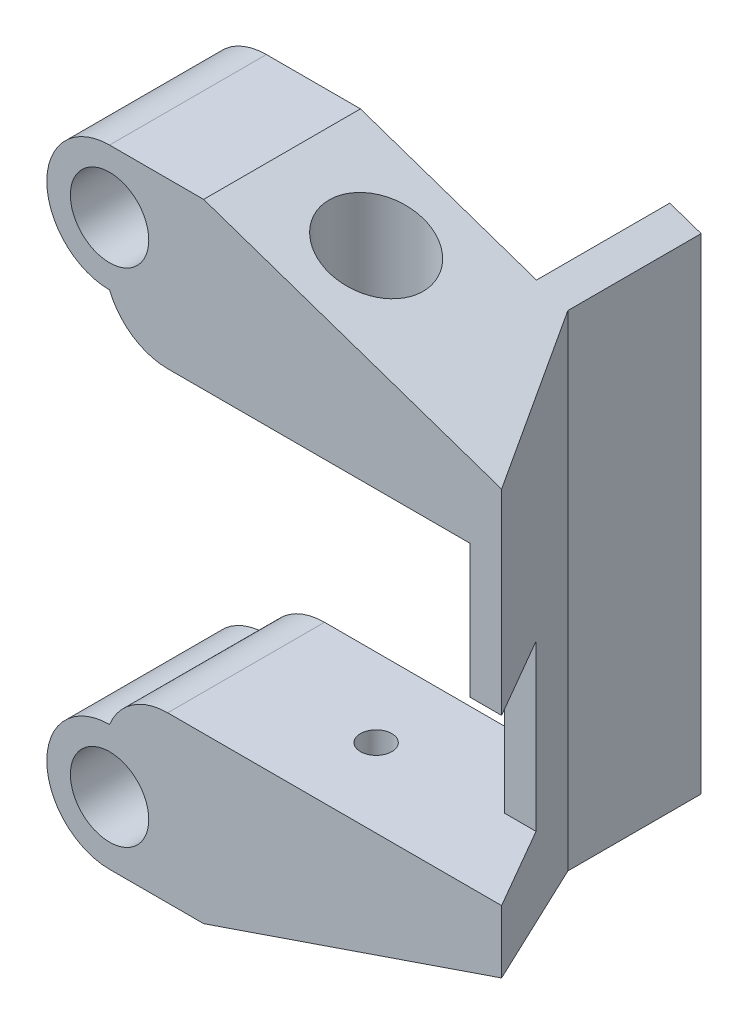
ISO-10303-21;
HEADER;
FILE_DESCRIPTION(('STEP AP214'),'2;1');
FILE_NAME('part.step','',(''),(''),'','','');
FILE_SCHEMA(('AUTOMOTIVE_DESIGN { 1 0 10303 214 1 1 1 1 }'));
ENDSEC;
DATA;
#1=APPLICATION_CONTEXT('core data for automotive mechanical design processes');
#2=APPLICATION_PROTOCOL_DEFINITION('international standard','automotive_design',2000,#1);
#3=PRODUCT_CONTEXT('',#1,'mechanical');
#4=PRODUCT('Part','Part','',(#3));
#5=PRODUCT_RELATED_PRODUCT_CATEGORY('part','',(#4));
#6=PRODUCT_DEFINITION_FORMATION('','',#4);
#7=PRODUCT_DEFINITION_CONTEXT('part definition',#1,'design');
#8=PRODUCT_DEFINITION('design','',#6,#7);
#9=PRODUCT_DEFINITION_SHAPE('','',#8);
#10=(LENGTH_UNIT() NAMED_UNIT(*) SI_UNIT(.MILLI.,.METRE.));
#11=(NAMED_UNIT(*) PLANE_ANGLE_UNIT() SI_UNIT($,.RADIAN.));
#12=(NAMED_UNIT(*) SI_UNIT($,.STERADIAN.) SOLID_ANGLE_UNIT());
#13=UNCERTAINTY_MEASURE_WITH_UNIT(LENGTH_MEASURE(1.E-05),#10,'distance_accuracy_value','');
#14=(GEOMETRIC_REPRESENTATION_CONTEXT(3) GLOBAL_UNCERTAINTY_ASSIGNED_CONTEXT((#13)) GLOBAL_UNIT_ASSIGNED_CONTEXT((#10,
#11,#12)) REPRESENTATION_CONTEXT('',''));
#15=CARTESIAN_POINT('',(0.,0.,0.));
#16=DIRECTION('',(0.,0.,1.));
#17=DIRECTION('',(1.,0.,0.));
#18=AXIS2_PLACEMENT_3D('',#15,#16,#17);
#19=CARTESIAN_POINT('',(-131.23163521819,16.2006515426683,10.));
#20=DIRECTION('',(0.,0.,1.));
#21=DIRECTION('',(1.,0.,0.));
#22=AXIS2_PLACEMENT_3D('',#19,#20,#21);
#23=PLANE('',#22);
#24=CARTESIAN_POINT('',(-131.23163521819,48.2006515426684,10.));
#25=DIRECTION('',(0.,0.,-1.));
#26=DIRECTION('',(1.,0.,0.));
#27=AXIS2_PLACEMENT_3D('',#24,#25,#26);
#28=CIRCLE('',#27,4.);
#29=CARTESIAN_POINT('',(-131.23163521819,44.2006515426684,10.));
#30=VERTEX_POINT('',#29);
#31=CARTESIAN_POINT('',(-131.23163521819,52.2006515426684,10.));
#32=VERTEX_POINT('',#31);
#33=EDGE_CURVE('E215',#30,#32,#28,.T.);
#34=ORIENTED_EDGE('',*,*,#33,.F.);
#35=CARTESIAN_POINT('',(-127.523535974642,45.7006515426684,10.));
#36=DIRECTION('',(0.,0.,1.));
#37=DIRECTION('',(1.,0.,0.));
#38=AXIS2_PLACEMENT_3D('',#35,#36,#37);
#39=CIRCLE('',#38,4.);
#40=CARTESIAN_POINT('',(-127.523535974642,41.7006515426684,10.));
#41=VERTEX_POINT('',#40);
#42=EDGE_CURVE('E203',#30,#41,#39,.T.);
#43=ORIENTED_EDGE('',*,*,#42,.T.);
#44=DIRECTION('',(-1.,0.,0.));
#45=VECTOR('',#44,1.);
#46=CARTESIAN_POINT('',(-106.23163521819,41.7006515426684,10.));
#47=LINE('',#46,#45);
#48=CARTESIAN_POINT('',(-108.23163521819,41.7006515426684,10.));
#49=VERTEX_POINT('',#48);
#50=EDGE_CURVE('E212',#49,#41,#47,.T.);
#51=ORIENTED_EDGE('',*,*,#50,.F.);
#52=DIRECTION('',(0.,-1.,0.));
#53=VECTOR('',#52,1.);
#54=CARTESIAN_POINT('',(-108.23163521819,32.2006515426684,10.));
#55=LINE('',#54,#53);
#56=CARTESIAN_POINT('',(-108.23163521819,33.2006515426684,10.));
#57=VERTEX_POINT('',#56);
#58=EDGE_CURVE('E195',#49,#57,#55,.T.);
#59=ORIENTED_EDGE('',*,*,#58,.T.);
#60=DIRECTION('',(-1.,0.,0.));
#61=VECTOR('',#60,1.);
#62=CARTESIAN_POINT('',(-108.23163521819,33.2006515426684,10.));
#63=LINE('',#62,#61);
#64=CARTESIAN_POINT('',(-106.23163521819,33.2006515426684,10.));
#65=VERTEX_POINT('',#64);
#66=EDGE_CURVE('E175',#65,#57,#63,.T.);
#67=ORIENTED_EDGE('',*,*,#66,.F.);
#68=DIRECTION('',(0.,1.,0.));
#69=VECTOR('',#68,1.);
#70=CARTESIAN_POINT('',(-106.23163521819,22.7006515426684,10.));
#71=LINE('',#70,#69);
#72=CARTESIAN_POINT('',(-106.23163521819,45.7006515426684,10.));
#73=VERTEX_POINT('',#72);
#74=EDGE_CURVE('E303',#65,#73,#71,.T.);
#75=ORIENTED_EDGE('',*,*,#74,.T.);
#76=DIRECTION('',(-0.946163984953356,0.323687679062991,0.));
#77=VECTOR('',#76,1.);
#78=CARTESIAN_POINT('',(-125.23163521819,52.2006515426684,10.));
#79=LINE('',#78,#77);
#80=CARTESIAN_POINT('',(-125.23163521819,52.2006515426684,10.));
#81=VERTEX_POINT('',#80);
#82=EDGE_CURVE('E672',#73,#81,#79,.T.);
#83=ORIENTED_EDGE('',*,*,#82,.T.);
#84=DIRECTION('',(1.,0.,0.));
#85=VECTOR('',#84,1.);
#86=CARTESIAN_POINT('',(-125.23163521819,52.2006515426684,10.));
#87=LINE('',#86,#85);
#88=EDGE_CURVE('E248',#32,#81,#87,.T.);
#89=ORIENTED_EDGE('',*,*,#88,.F.);
#90=EDGE_LOOP('',(#34,#43,#51,#59,#67,#75,#83,#89));
#91=FACE_BOUND('',#90,.T.);
#92=CARTESIAN_POINT('',(-131.23163521819,48.2006515426684,10.));
#93=DIRECTION('',(0.,0.,-1.));
#94=DIRECTION('',(1.,0.,0.));
#95=AXIS2_PLACEMENT_3D('',#92,#93,#94);
#96=CIRCLE('',#95,2.5);
#97=CARTESIAN_POINT('',(-128.73163521819,48.2006515426684,10.));
#98=VERTEX_POINT('',#97);
#99=EDGE_CURVE('E243',#98,#98,#96,.T.);
#100=ORIENTED_EDGE('',*,*,#99,.T.);
#101=EDGE_LOOP('',(#100));
#102=FACE_BOUND('',#101,.T.);
#103=ADVANCED_FACE('F33',(#91,#102),#23,.T.);
#104=CARTESIAN_POINT('',(-131.23163521819,16.2006515426683,0.));
#105=DIRECTION('',(0.,0.,1.));
#106=DIRECTION('',(1.,0.,0.));
#107=AXIS2_PLACEMENT_3D('',#104,#105,#106);
#108=PLANE('',#107);
#109=CARTESIAN_POINT('',(-131.23163521819,16.2006515426684,0.));
#110=DIRECTION('',(0.,0.,1.));
#111=DIRECTION('',(1.,0.,0.));
#112=AXIS2_PLACEMENT_3D('',#109,#110,#111);
#113=CIRCLE('',#112,2.5);
#114=CARTESIAN_POINT('',(-128.73163521819,16.2006515426684,0.));
#115=VERTEX_POINT('',#114);
#116=EDGE_CURVE('E291',#115,#115,#113,.T.);
#117=ORIENTED_EDGE('',*,*,#116,.T.);
#118=EDGE_LOOP('',(#117));
#119=FACE_BOUND('',#118,.T.);
#120=CARTESIAN_POINT('',(-131.23163521819,16.2006515426683,0.));
#121=DIRECTION('',(0.,0.,1.));
#122=DIRECTION('',(1.,0.,0.));
#123=AXIS2_PLACEMENT_3D('',#120,#121,#122);
#124=CIRCLE('',#123,4.);
#125=CARTESIAN_POINT('',(-131.23163521819,20.2006515426683,0.));
#126=VERTEX_POINT('',#125);
#127=CARTESIAN_POINT('',(-131.23163521819,12.2006515426684,0.));
#128=VERTEX_POINT('',#127);
#129=EDGE_CURVE('E311',#126,#128,#124,.T.);
#130=ORIENTED_EDGE('',*,*,#129,.F.);
#131=CARTESIAN_POINT('',(-127.523535974642,18.7006515426684,0.));
#132=DIRECTION('',(0.,0.,1.));
#133=DIRECTION('',(1.,0.,0.));
#134=AXIS2_PLACEMENT_3D('',#131,#132,#133);
#135=CIRCLE('',#134,4.);
#136=CARTESIAN_POINT('',(-127.523535974642,22.7006515426684,0.));
#137=VERTEX_POINT('',#136);
#138=EDGE_CURVE('E55',#126,#137,#135,.F.);
#139=ORIENTED_EDGE('',*,*,#138,.T.);
#140=DIRECTION('',(-1.,0.,0.));
#141=VECTOR('',#140,1.);
#142=CARTESIAN_POINT('',(-106.23163521819,22.7006515426684,0.));
#143=LINE('',#142,#141);
#144=CARTESIAN_POINT('',(-114.005137910086,22.7006515426684,0.));
#145=VERTEX_POINT('',#144);
#146=EDGE_CURVE('E296',#145,#137,#143,.T.);
#147=ORIENTED_EDGE('',*,*,#146,.F.);
#148=DIRECTION('',(0.,1.,0.));
#149=VECTOR('',#148,1.);
#150=CARTESIAN_POINT('',(-114.005137910086,32.2006515426684,0.));
#151=LINE('',#150,#149);
#152=CARTESIAN_POINT('',(-114.005137910086,16.0412953585986,0.));
#153=VERTEX_POINT('',#152);
#154=EDGE_CURVE('E251',#153,#145,#151,.T.);
#155=ORIENTED_EDGE('',*,*,#154,.F.);
#156=DIRECTION('',(-0.946163984953356,-0.323687679062991,0.));
#157=VECTOR('',#156,1.);
#158=CARTESIAN_POINT('',(-125.23163521819,12.2006515426684,0.));
#159=LINE('',#158,#157);
#160=CARTESIAN_POINT('',(-125.23163521819,12.2006515426684,0.));
#161=VERTEX_POINT('',#160);
#162=EDGE_CURVE('E276',#153,#161,#159,.T.);
#163=ORIENTED_EDGE('',*,*,#162,.T.);
#164=DIRECTION('',(1.,0.,0.));
#165=VECTOR('',#164,1.);
#166=CARTESIAN_POINT('',(-125.23163521819,12.2006515426684,0.));
#167=LINE('',#166,#165);
#168=EDGE_CURVE('E313',#128,#161,#167,.T.);
#169=ORIENTED_EDGE('',*,*,#168,.F.);
#170=EDGE_LOOP('',(#130,#139,#147,#155,#163,#169));
#171=FACE_BOUND('',#170,.T.);
#172=ADVANCED_FACE('F323',(#119,#171),#108,.F.);
#173=CARTESIAN_POINT('',(-119.23163521819,22.7006515426684,5.));
#174=DIRECTION('',(0.,-1.,0.));
#175=DIRECTION('',(0.,0.,-1.));
#176=AXIS2_PLACEMENT_3D('',#173,#174,#175);
#177=CYLINDRICAL_SURFACE('',#176,0.999999999999998);
#178=CARTESIAN_POINT('',(-119.23163521819,22.7006515426684,5.));
#179=DIRECTION('',(0.,-1.,0.));
#180=DIRECTION('',(0.,0.,-1.));
#181=AXIS2_PLACEMENT_3D('',#178,#179,#180);
#182=CIRCLE('',#181,0.999999999999998);
#183=CARTESIAN_POINT('',(-119.23163521819,22.7006515426684,4.));
#184=VERTEX_POINT('',#183);
#185=EDGE_CURVE('E288',#184,#184,#182,.T.);
#186=ORIENTED_EDGE('',*,*,#185,.F.);
#187=EDGE_LOOP('',(#186));
#188=FACE_BOUND('',#187,.T.);
#189=CARTESIAN_POINT('',(-119.23163521819,19.7006515426684,5.));
#190=DIRECTION('',(0.,-1.,0.));
#191=DIRECTION('',(0.,0.,-1.));
#192=AXIS2_PLACEMENT_3D('',#189,#190,#191);
#193=CIRCLE('',#192,0.999999999999998);
#194=CARTESIAN_POINT('',(-119.23163521819,19.7006515426684,4.));
#195=VERTEX_POINT('',#194);
#196=EDGE_CURVE('E192',#195,#195,#193,.F.);
#197=ORIENTED_EDGE('',*,*,#196,.F.);
#198=EDGE_LOOP('',(#197));
#199=FACE_BOUND('',#198,.T.);
#200=ADVANCED_FACE('F348',(#188,#199),#177,.F.);
#201=DIRECTION('',(-1.,0.,0.));
#202=VECTOR('',#201,1.);
#203=CARTESIAN_POINT('',(-106.23163521819,22.7006515426684,10.));
#204=LINE('',#203,#202);
#205=CARTESIAN_POINT('',(-106.23163521819,22.7006515426684,10.));
#206=VERTEX_POINT('',#205);
#207=CARTESIAN_POINT('',(-127.523535974642,22.7006515426684,10.));
#208=VERTEX_POINT('',#207);
#209=EDGE_CURVE('E302',#206,#208,#204,.T.);
#210=ORIENTED_EDGE('',*,*,#209,.T.);
#211=CARTESIAN_POINT('',(-127.523535974642,18.7006515426684,10.));
#212=DIRECTION('',(0.,0.,1.));
#213=DIRECTION('',(1.,0.,0.));
#214=AXIS2_PLACEMENT_3D('',#211,#212,#213);
#215=CIRCLE('',#214,4.);
#216=CARTESIAN_POINT('',(-131.23163521819,20.2006515426683,10.));
#217=VERTEX_POINT('',#216);
#218=EDGE_CURVE('E11',#208,#217,#215,.T.);
#219=ORIENTED_EDGE('',*,*,#218,.T.);
#220=CARTESIAN_POINT('',(-131.23163521819,16.2006515426683,10.));
#221=DIRECTION('',(0.,0.,1.));
#222=DIRECTION('',(1.,0.,0.));
#223=AXIS2_PLACEMENT_3D('',#220,#221,#222);
#224=CIRCLE('',#223,4.);
#225=CARTESIAN_POINT('',(-131.23163521819,12.2006515426684,10.));
#226=VERTEX_POINT('',#225);
#227=EDGE_CURVE('E305',#217,#226,#224,.T.);
#228=ORIENTED_EDGE('',*,*,#227,.T.);
#229=DIRECTION('',(1.,0.,0.));
#230=VECTOR('',#229,1.);
#231=CARTESIAN_POINT('',(-125.23163521819,12.2006515426684,10.));
#232=LINE('',#231,#230);
#233=CARTESIAN_POINT('',(-125.23163521819,12.2006515426684,10.));
#234=VERTEX_POINT('',#233);
#235=EDGE_CURVE('E307',#226,#234,#232,.T.);
#236=ORIENTED_EDGE('',*,*,#235,.T.);
#237=DIRECTION('',(-0.946163984953356,-0.323687679062991,0.));
#238=VECTOR('',#237,1.);
#239=CARTESIAN_POINT('',(-125.23163521819,12.2006515426684,10.));
#240=LINE('',#239,#238);
#241=CARTESIAN_POINT('',(-106.23163521819,18.7006515426684,10.));
#242=VERTEX_POINT('',#241);
#243=EDGE_CURVE('E275',#242,#234,#240,.T.);
#244=ORIENTED_EDGE('',*,*,#243,.F.);
#245=EDGE_CURVE('E299',#242,#206,#71,.T.);
#246=ORIENTED_EDGE('',*,*,#245,.T.);
#247=EDGE_LOOP('',(#210,#219,#228,#236,#244,#246));
#248=FACE_BOUND('',#247,.T.);
#249=CARTESIAN_POINT('',(-131.23163521819,16.2006515426684,10.));
#250=DIRECTION('',(0.,0.,1.));
#251=DIRECTION('',(1.,0.,0.));
#252=AXIS2_PLACEMENT_3D('',#249,#250,#251);
#253=CIRCLE('',#252,2.5);
#254=CARTESIAN_POINT('',(-128.73163521819,16.2006515426684,10.));
#255=VERTEX_POINT('',#254);
#256=EDGE_CURVE('E293',#255,#255,#253,.T.);
#257=ORIENTED_EDGE('',*,*,#256,.F.);
#258=EDGE_LOOP('',(#257));
#259=FACE_BOUND('',#258,.T.);
#260=ADVANCED_FACE('F332',(#248,#259),#23,.T.);
#261=CARTESIAN_POINT('',(-106.23163521819,22.7006515426684,10.));
#262=DIRECTION('',(0.,-1.,0.));
#263=DIRECTION('',(0.,0.,-1.));
#264=AXIS2_PLACEMENT_3D('',#261,#262,#263);
#265=PLANE('',#264);
#266=ORIENTED_EDGE('',*,*,#185,.T.);
#267=EDGE_LOOP('',(#266));
#268=FACE_BOUND('',#267,.T.);
#269=ORIENTED_EDGE('',*,*,#146,.T.);
#270=DIRECTION('',(0.,0.,-1.));
#271=VECTOR('',#270,1.);
#272=CARTESIAN_POINT('',(-127.523535974642,22.7006515426684,10.));
#273=LINE('',#272,#271);
#274=EDGE_CURVE('E41',#137,#208,#273,.F.);
#275=ORIENTED_EDGE('',*,*,#274,.T.);
#276=ORIENTED_EDGE('',*,*,#209,.F.);
#277=DIRECTION('',(0.499999999999995,0.,0.866025403784441));
#278=VECTOR('',#277,1.);
#279=CARTESIAN_POINT('',(-109.23163521819,22.7006515426684,4.80384757729335));
#280=LINE('',#279,#278);
#281=CARTESIAN_POINT('',(-109.23163521819,22.7006515426684,4.80384757729335));
#282=VERTEX_POINT('',#281);
#283=EDGE_CURVE('E162',#282,#206,#280,.T.);
#284=ORIENTED_EDGE('',*,*,#283,.F.);
#285=DIRECTION('',(1.,0.,0.));
#286=VECTOR('',#285,1.);
#287=CARTESIAN_POINT('',(-111.23163521819,22.7006515426684,4.80384757729335));
#288=LINE('',#287,#286);
#289=CARTESIAN_POINT('',(-111.23163521819,22.7006515426684,4.80384757729335));
#290=VERTEX_POINT('',#289);
#291=EDGE_CURVE('E155',#290,#282,#288,.T.);
#292=ORIENTED_EDGE('',*,*,#291,.F.);
#293=DIRECTION('',(-0.499999999999995,0.,-0.866025403784442));
#294=VECTOR('',#293,1.);
#295=CARTESIAN_POINT('',(-107.73163521819,22.7006515426684,10.8660254037844));
#296=LINE('',#295,#294);
#297=EDGE_CURVE('E159',#290,#145,#296,.T.);
#298=ORIENTED_EDGE('',*,*,#297,.T.);
#299=EDGE_LOOP('',(#269,#275,#276,#284,#292,#298));
#300=FACE_BOUND('',#299,.T.);
#301=ADVANCED_FACE('F157',(#268,#300),#265,.F.);
#302=CARTESIAN_POINT('',(-131.23163521819,16.2006515426683,10.));
#303=DIRECTION('',(0.,0.,-1.));
#304=DIRECTION('',(-1.,0.,0.));
#305=AXIS2_PLACEMENT_3D('',#302,#303,#304);
#306=CYLINDRICAL_SURFACE('',#305,4.);
#307=ORIENTED_EDGE('',*,*,#129,.T.);
#308=DIRECTION('',(0.,0.,-1.));
#309=VECTOR('',#308,1.);
#310=CARTESIAN_POINT('',(-131.23163521819,12.2006515426684,10.));
#311=LINE('',#310,#309);
#312=EDGE_CURVE('E188',#226,#128,#311,.T.);
#313=ORIENTED_EDGE('',*,*,#312,.F.);
#314=ORIENTED_EDGE('',*,*,#227,.F.);
#315=DIRECTION('',(0.,0.,-1.));
#316=VECTOR('',#315,1.);
#317=CARTESIAN_POINT('',(-131.23163521819,20.2006515426683,10.));
#318=LINE('',#317,#316);
#319=EDGE_CURVE('E182',#217,#126,#318,.T.);
#320=ORIENTED_EDGE('',*,*,#319,.T.);
#321=EDGE_LOOP('',(#307,#313,#314,#320));
#322=FACE_BOUND('',#321,.T.);
#323=ADVANCED_FACE('F337',(#322),#306,.T.);
#324=CARTESIAN_POINT('',(-125.23163521819,12.2006515426684,10.));
#325=DIRECTION('',(0.,1.,0.));
#326=DIRECTION('',(0.,0.,1.));
#327=AXIS2_PLACEMENT_3D('',#324,#325,#326);
#328=PLANE('',#327);
#329=ORIENTED_EDGE('',*,*,#168,.T.);
#330=DIRECTION('',(0.,0.,1.));
#331=VECTOR('',#330,1.);
#332=CARTESIAN_POINT('',(-125.23163521819,12.2006515426684,0.));
#333=LINE('',#332,#331);
#334=EDGE_CURVE('E200',#161,#234,#333,.T.);
#335=ORIENTED_EDGE('',*,*,#334,.T.);
#336=ORIENTED_EDGE('',*,*,#235,.F.);
#337=ORIENTED_EDGE('',*,*,#312,.T.);
#338=EDGE_LOOP('',(#329,#335,#336,#337));
#339=FACE_BOUND('',#338,.T.);
#340=ADVANCED_FACE('F320',(#339),#328,.F.);
#341=CARTESIAN_POINT('',(-131.23163521819,16.2006515426684,10.));
#342=DIRECTION('',(0.,0.,-1.));
#343=DIRECTION('',(-1.,0.,0.));
#344=AXIS2_PLACEMENT_3D('',#341,#342,#343);
#345=CYLINDRICAL_SURFACE('',#344,2.5);
#346=ORIENTED_EDGE('',*,*,#256,.T.);
#347=EDGE_LOOP('',(#346));
#348=FACE_BOUND('',#347,.T.);
#349=ORIENTED_EDGE('',*,*,#116,.F.);
#350=EDGE_LOOP('',(#349));
#351=FACE_BOUND('',#350,.T.);
#352=ADVANCED_FACE('F370',(#348,#351),#345,.F.);
#353=CARTESIAN_POINT('',(-106.23163521819,22.7006515426684,9.99999999999999));
#354=DIRECTION('',(-0.866025403784442,0.,0.499999999999995));
#355=DIRECTION('',(0.499999999999995,0.,0.866025403784442));
#356=AXIS2_PLACEMENT_3D('',#353,#354,#355);
#357=PLANE('',#356);
#358=ORIENTED_EDGE('',*,*,#74,.F.);
#359=DIRECTION('',(0.499999999999995,0.,0.866025403784441));
#360=VECTOR('',#359,1.);
#361=CARTESIAN_POINT('',(-109.23163521819,33.2006515426684,4.80384757729335));
#362=LINE('',#361,#360);
#363=CARTESIAN_POINT('',(-109.23163521819,33.2006515426684,4.80384757729335));
#364=VERTEX_POINT('',#363);
#365=EDGE_CURVE('E707',#364,#65,#362,.T.);
#366=ORIENTED_EDGE('',*,*,#365,.F.);
#367=DIRECTION('',(0.,1.,0.));
#368=VECTOR('',#367,1.);
#369=CARTESIAN_POINT('',(-109.23163521819,22.7006515426684,4.80384757729335));
#370=LINE('',#369,#368);
#371=EDGE_CURVE('E165',#282,#364,#370,.T.);
#372=ORIENTED_EDGE('',*,*,#371,.F.);
#373=ORIENTED_EDGE('',*,*,#283,.T.);
#374=ORIENTED_EDGE('',*,*,#245,.F.);
#375=DIRECTION('',(-0.492841949870909,-0.168603824955838,-0.853627297277741));
#376=VECTOR('',#375,1.);
#377=CARTESIAN_POINT('',(-105.899255066802,18.8143605418273,10.575699309631));
#378=LINE('',#377,#376);
#379=CARTESIAN_POINT('',(-112.005137910086,16.7255058849144,0.));
#380=VERTEX_POINT('',#379);
#381=EDGE_CURVE('E199',#242,#380,#378,.T.);
#382=ORIENTED_EDGE('',*,*,#381,.T.);
#383=DIRECTION('',(0.,-1.,0.));
#384=VECTOR('',#383,1.);
#385=CARTESIAN_POINT('',(-112.005137910086,22.7006515426684,0.));
#386=LINE('',#385,#384);
#387=CARTESIAN_POINT('',(-112.005137910086,47.6757972004223,0.));
#388=VERTEX_POINT('',#387);
#389=EDGE_CURVE('E286',#388,#380,#386,.T.);
#390=ORIENTED_EDGE('',*,*,#389,.F.);
#391=DIRECTION('',(-0.492841949870909,0.168603824955838,-0.853627297277741));
#392=VECTOR('',#391,1.);
#393=CARTESIAN_POINT('',(-105.899255066802,45.5869425435094,10.575699309631));
#394=LINE('',#393,#392);
#395=EDGE_CURVE('E260',#73,#388,#394,.T.);
#396=ORIENTED_EDGE('',*,*,#395,.F.);
#397=EDGE_LOOP('',(#358,#366,#372,#373,#374,#382,#390,#396));
#398=FACE_BOUND('',#397,.T.);
#399=ADVANCED_FACE('F368',(#398),#357,.F.);
#400=CARTESIAN_POINT('',(-108.23163521819,32.2006515426684,10.));
#401=DIRECTION('',(-0.866025403784442,0.,0.499999999999995));
#402=DIRECTION('',(0.499999999999995,0.,0.866025403784442));
#403=AXIS2_PLACEMENT_3D('',#400,#401,#402);
#404=PLANE('',#403);
#405=DIRECTION('',(0.499999999999995,0.,0.866025403784441));
#406=VECTOR('',#405,1.);
#407=CARTESIAN_POINT('',(-111.23163521819,33.2006515426684,4.80384757729335));
#408=LINE('',#407,#406);
#409=CARTESIAN_POINT('',(-111.23163521819,33.2006515426684,4.80384757729335));
#410=VERTEX_POINT('',#409);
#411=EDGE_CURVE('E704',#410,#57,#408,.T.);
#412=ORIENTED_EDGE('',*,*,#411,.T.);
#413=ORIENTED_EDGE('',*,*,#58,.F.);
#414=DIRECTION('',(-0.499999999999995,0.,-0.866025403784442));
#415=VECTOR('',#414,1.);
#416=CARTESIAN_POINT('',(-107.73163521819,41.7006515426684,10.8660254037844));
#417=LINE('',#416,#415);
#418=CARTESIAN_POINT('',(-114.005137910086,41.7006515426684,0.));
#419=VERTEX_POINT('',#418);
#420=EDGE_CURVE('E224',#49,#419,#417,.T.);
#421=ORIENTED_EDGE('',*,*,#420,.T.);
#422=DIRECTION('',(0.,-1.,0.));
#423=VECTOR('',#422,1.);
#424=CARTESIAN_POINT('',(-114.005137910086,32.2006515426684,0.));
#425=LINE('',#424,#423);
#426=EDGE_CURVE('E180',#419,#145,#425,.T.);
#427=ORIENTED_EDGE('',*,*,#426,.T.);
#428=ORIENTED_EDGE('',*,*,#297,.F.);
#429=DIRECTION('',(0.,-1.,0.));
#430=VECTOR('',#429,1.);
#431=CARTESIAN_POINT('',(-111.23163521819,22.7006515426684,4.80384757729335));
#432=LINE('',#431,#430);
#433=EDGE_CURVE('E166',#410,#290,#432,.T.);
#434=ORIENTED_EDGE('',*,*,#433,.F.);
#435=EDGE_LOOP('',(#412,#413,#421,#427,#428,#434));
#436=FACE_BOUND('',#435,.T.);
#437=ADVANCED_FACE('F178',(#436),#404,.T.);
#438=CARTESIAN_POINT('',(-119.23163521819,19.7006515426684,5.));
#439=DIRECTION('',(0.,-1.,0.));
#440=DIRECTION('',(0.,0.,-1.));
#441=AXIS2_PLACEMENT_3D('',#438,#439,#440);
#442=PLANE('',#441);
#443=CARTESIAN_POINT('',(-119.23163521819,19.7006515426684,5.));
#444=DIRECTION('',(0.,-1.,0.));
#445=DIRECTION('',(0.,0.,-1.));
#446=AXIS2_PLACEMENT_3D('',#443,#444,#445);
#447=CIRCLE('',#446,3.00000000000001);
#448=CARTESIAN_POINT('',(-119.23163521819,19.7006515426684,1.99999999999999));
#449=VERTEX_POINT('',#448);
#450=EDGE_CURVE('E196',#449,#449,#447,.T.);
#451=ORIENTED_EDGE('',*,*,#450,.T.);
#452=EDGE_LOOP('',(#451));
#453=FACE_BOUND('',#452,.T.);
#454=ORIENTED_EDGE('',*,*,#196,.T.);
#455=EDGE_LOOP('',(#454));
#456=FACE_BOUND('',#455,.T.);
#457=ADVANCED_FACE('F442',(#453,#456),#442,.T.);
#458=CARTESIAN_POINT('',(-119.23163521819,19.7006515426684,5.));
#459=DIRECTION('',(0.,-1.,0.));
#460=DIRECTION('',(0.,0.,-1.));
#461=AXIS2_PLACEMENT_3D('',#458,#459,#460);
#462=CYLINDRICAL_SURFACE('',#461,3.00000000000001);
#463=CARTESIAN_POINT('',(-119.23163521819,14.2532831216157,5.));
#464=DIRECTION('',(-0.323687679062991,0.946163984953356,0.));
#465=DIRECTION('',(-0.946163984953356,-0.323687679062991,0.));
#466=AXIS2_PLACEMENT_3D('',#463,#464,#465);
#467=ELLIPSE('',#466,3.17069773074051,3.00000000000001);
#468=CARTESIAN_POINT('',(-122.23163521819,13.226967332142,5.));
#469=VERTEX_POINT('',#468);
#470=EDGE_CURVE('E197',#469,#469,#467,.F.);
#471=ORIENTED_EDGE('',*,*,#470,.T.);
#472=EDGE_LOOP('',(#471));
#473=FACE_BOUND('',#472,.T.);
#474=ORIENTED_EDGE('',*,*,#450,.F.);
#475=EDGE_LOOP('',(#474));
#476=FACE_BOUND('',#475,.T.);
#477=ADVANCED_FACE('F557',(#473,#476),#462,.F.);
#478=CARTESIAN_POINT('',(-125.23163521819,12.2006515426684,0.));
#479=DIRECTION('',(-0.323687679062991,0.946163984953356,0.));
#480=DIRECTION('',(-0.946163984953356,-0.323687679062991,0.));
#481=AXIS2_PLACEMENT_3D('',#478,#479,#480);
#482=PLANE('',#481);
#483=ORIENTED_EDGE('',*,*,#470,.F.);
#484=EDGE_LOOP('',(#483));
#485=FACE_BOUND('',#484,.T.);
#486=ORIENTED_EDGE('',*,*,#243,.T.);
#487=ORIENTED_EDGE('',*,*,#334,.F.);
#488=ORIENTED_EDGE('',*,*,#162,.F.);
#489=DIRECTION('',(0.,0.,1.));
#490=VECTOR('',#489,1.);
#491=CARTESIAN_POINT('',(-114.005137910086,16.0412953585986,-8.5));
#492=LINE('',#491,#490);
#493=CARTESIAN_POINT('',(-114.005137910086,16.0412953585986,-8.5));
#494=VERTEX_POINT('',#493);
#495=EDGE_CURVE('E273',#494,#153,#492,.T.);
#496=ORIENTED_EDGE('',*,*,#495,.F.);
#497=DIRECTION('',(-0.946163984953356,-0.323687679062991,0.));
#498=VECTOR('',#497,1.);
#499=CARTESIAN_POINT('',(-114.005137910086,16.0412953585986,-8.5));
#500=LINE('',#499,#498);
#501=CARTESIAN_POINT('',(-112.005137910086,16.7255058849144,-8.5));
#502=VERTEX_POINT('',#501);
#503=EDGE_CURVE('E262',#502,#494,#500,.T.);
#504=ORIENTED_EDGE('',*,*,#503,.F.);
#505=DIRECTION('',(0.,0.,1.));
#506=VECTOR('',#505,1.);
#507=CARTESIAN_POINT('',(-112.005137910086,16.7255058849144,-8.5));
#508=LINE('',#507,#506);
#509=EDGE_CURVE('E269',#502,#380,#508,.T.);
#510=ORIENTED_EDGE('',*,*,#509,.T.);
#511=ORIENTED_EDGE('',*,*,#381,.F.);
#512=EDGE_LOOP('',(#486,#487,#488,#496,#504,#510,#511));
#513=FACE_BOUND('',#512,.T.);
#514=ADVANCED_FACE('F329',(#485,#513),#482,.F.);
#515=CARTESIAN_POINT('',(-114.005137910086,32.2006515426684,-8.5));
#516=DIRECTION('',(1.,0.,0.));
#517=DIRECTION('',(0.,0.,-1.));
#518=AXIS2_PLACEMENT_3D('',#515,#516,#517);
#519=PLANE('',#518);
#520=ORIENTED_EDGE('',*,*,#154,.T.);
#521=ORIENTED_EDGE('',*,*,#426,.F.);
#522=DIRECTION('',(0.,-1.,0.));
#523=VECTOR('',#522,1.);
#524=CARTESIAN_POINT('',(-114.005137910086,32.2006515426684,0.));
#525=LINE('',#524,#523);
#526=CARTESIAN_POINT('',(-114.005137910086,48.3600077267381,0.));
#527=VERTEX_POINT('',#526);
#528=EDGE_CURVE('E701',#527,#419,#525,.T.);
#529=ORIENTED_EDGE('',*,*,#528,.F.);
#530=DIRECTION('',(0.,0.,1.));
#531=VECTOR('',#530,1.);
#532=CARTESIAN_POINT('',(-114.005137910086,48.3600077267381,-8.5));
#533=LINE('',#532,#531);
#534=CARTESIAN_POINT('',(-114.005137910086,48.3600077267381,-8.5));
#535=VERTEX_POINT('',#534);
#536=EDGE_CURVE('E679',#535,#527,#533,.T.);
#537=ORIENTED_EDGE('',*,*,#536,.F.);
#538=DIRECTION('',(0.,1.,0.));
#539=VECTOR('',#538,1.);
#540=CARTESIAN_POINT('',(-114.005137910086,22.7006515426684,-8.5));
#541=LINE('',#540,#539);
#542=EDGE_CURVE('E265',#494,#535,#541,.T.);
#543=ORIENTED_EDGE('',*,*,#542,.F.);
#544=ORIENTED_EDGE('',*,*,#495,.T.);
#545=EDGE_LOOP('',(#520,#521,#529,#537,#543,#544));
#546=FACE_BOUND('',#545,.T.);
#547=ADVANCED_FACE('F540',(#546),#519,.F.);
#548=CARTESIAN_POINT('',(-112.005137910086,16.7255058849144,-8.5));
#549=DIRECTION('',(-1.,0.,0.));
#550=DIRECTION('',(0.,0.,1.));
#551=AXIS2_PLACEMENT_3D('',#548,#549,#550);
#552=PLANE('',#551);
#553=ORIENTED_EDGE('',*,*,#389,.T.);
#554=ORIENTED_EDGE('',*,*,#509,.F.);
#555=DIRECTION('',(0.,-1.,0.));
#556=VECTOR('',#555,1.);
#557=CARTESIAN_POINT('',(-112.005137910086,16.7255058849144,-8.5));
#558=LINE('',#557,#556);
#559=CARTESIAN_POINT('',(-112.005137910086,47.6757972004223,-8.5));
#560=VERTEX_POINT('',#559);
#561=EDGE_CURVE('E267',#560,#502,#558,.T.);
#562=ORIENTED_EDGE('',*,*,#561,.F.);
#563=DIRECTION('',(0.,0.,1.));
#564=VECTOR('',#563,1.);
#565=CARTESIAN_POINT('',(-112.005137910086,47.6757972004223,-8.5));
#566=LINE('',#565,#564);
#567=EDGE_CURVE('E682',#560,#388,#566,.T.);
#568=ORIENTED_EDGE('',*,*,#567,.T.);
#569=EDGE_LOOP('',(#553,#554,#562,#568));
#570=FACE_BOUND('',#569,.T.);
#571=ADVANCED_FACE('F528',(#570),#552,.F.);
#572=CARTESIAN_POINT('',(0.,0.,-8.5));
#573=DIRECTION('',(0.,0.,1.));
#574=DIRECTION('',(1.,0.,0.));
#575=AXIS2_PLACEMENT_3D('',#572,#573,#574);
#576=PLANE('',#575);
#577=ORIENTED_EDGE('',*,*,#503,.T.);
#578=ORIENTED_EDGE('',*,*,#542,.T.);
#579=DIRECTION('',(-0.946163984953356,0.323687679062991,0.));
#580=VECTOR('',#579,1.);
#581=CARTESIAN_POINT('',(-114.005137910086,48.3600077267381,-8.5));
#582=LINE('',#581,#580);
#583=EDGE_CURVE('E699',#560,#535,#582,.T.);
#584=ORIENTED_EDGE('',*,*,#583,.F.);
#585=ORIENTED_EDGE('',*,*,#561,.T.);
#586=EDGE_LOOP('',(#577,#578,#584,#585));
#587=FACE_BOUND('',#586,.T.);
#588=ADVANCED_FACE('F523',(#587),#576,.F.);
#589=CARTESIAN_POINT('',(-131.23163521819,48.2006515426684,0.));
#590=DIRECTION('',(0.,0.,1.));
#591=DIRECTION('',(1.,0.,0.));
#592=AXIS2_PLACEMENT_3D('',#589,#590,#591);
#593=PLANE('',#592);
#594=CARTESIAN_POINT('',(-131.23163521819,48.2006515426684,0.));
#595=DIRECTION('',(0.,0.,-1.));
#596=DIRECTION('',(1.,0.,0.));
#597=AXIS2_PLACEMENT_3D('',#594,#595,#596);
#598=CIRCLE('',#597,2.5);
#599=CARTESIAN_POINT('',(-128.73163521819,48.2006515426684,0.));
#600=VERTEX_POINT('',#599);
#601=EDGE_CURVE('E660',#600,#600,#598,.T.);
#602=ORIENTED_EDGE('',*,*,#601,.F.);
#603=EDGE_LOOP('',(#602));
#604=FACE_BOUND('',#603,.T.);
#605=DIRECTION('',(-1.,0.,0.));
#606=VECTOR('',#605,1.);
#607=CARTESIAN_POINT('',(-106.23163521819,41.7006515426684,0.));
#608=LINE('',#607,#606);
#609=CARTESIAN_POINT('',(-127.523535974642,41.7006515426684,0.));
#610=VERTEX_POINT('',#609);
#611=EDGE_CURVE('E236',#419,#610,#608,.T.);
#612=ORIENTED_EDGE('',*,*,#611,.T.);
#613=CARTESIAN_POINT('',(-127.523535974642,45.7006515426684,0.));
#614=DIRECTION('',(0.,0.,1.));
#615=DIRECTION('',(1.,0.,0.));
#616=AXIS2_PLACEMENT_3D('',#613,#614,#615);
#617=CIRCLE('',#616,4.);
#618=CARTESIAN_POINT('',(-131.23163521819,44.2006515426684,0.));
#619=VERTEX_POINT('',#618);
#620=EDGE_CURVE('E185',#610,#619,#617,.F.);
#621=ORIENTED_EDGE('',*,*,#620,.T.);
#622=CARTESIAN_POINT('',(-131.23163521819,48.2006515426684,0.));
#623=DIRECTION('',(0.,0.,-1.));
#624=DIRECTION('',(1.,0.,0.));
#625=AXIS2_PLACEMENT_3D('',#622,#623,#624);
#626=CIRCLE('',#625,4.);
#627=CARTESIAN_POINT('',(-131.23163521819,52.2006515426684,0.));
#628=VERTEX_POINT('',#627);
#629=EDGE_CURVE('E234',#619,#628,#626,.T.);
#630=ORIENTED_EDGE('',*,*,#629,.T.);
#631=DIRECTION('',(1.,0.,0.));
#632=VECTOR('',#631,1.);
#633=CARTESIAN_POINT('',(-125.23163521819,52.2006515426684,0.));
#634=LINE('',#633,#632);
#635=CARTESIAN_POINT('',(-125.23163521819,52.2006515426684,0.));
#636=VERTEX_POINT('',#635);
#637=EDGE_CURVE('E225',#628,#636,#634,.T.);
#638=ORIENTED_EDGE('',*,*,#637,.T.);
#639=DIRECTION('',(-0.946163984953356,0.323687679062991,0.));
#640=VECTOR('',#639,1.);
#641=CARTESIAN_POINT('',(-125.23163521819,52.2006515426684,0.));
#642=LINE('',#641,#640);
#643=EDGE_CURVE('E678',#527,#636,#642,.T.);
#644=ORIENTED_EDGE('',*,*,#643,.F.);
#645=ORIENTED_EDGE('',*,*,#528,.T.);
#646=EDGE_LOOP('',(#612,#621,#630,#638,#644,#645));
#647=FACE_BOUND('',#646,.T.);
#648=ADVANCED_FACE('F232',(#604,#647),#593,.F.);
#649=CARTESIAN_POINT('',(-119.23163521819,41.7006515426684,5.));
#650=DIRECTION('',(0.,1.,0.));
#651=DIRECTION('',(0.,0.,-1.));
#652=AXIS2_PLACEMENT_3D('',#649,#650,#651);
#653=CYLINDRICAL_SURFACE('',#652,0.999999999999998);
#654=CARTESIAN_POINT('',(-119.23163521819,41.7006515426684,5.));
#655=DIRECTION('',(0.,-1.,0.));
#656=DIRECTION('',(0.,0.,-1.));
#657=AXIS2_PLACEMENT_3D('',#654,#655,#656);
#658=CIRCLE('',#657,0.999999999999998);
#659=CARTESIAN_POINT('',(-119.23163521819,41.7006515426684,4.));
#660=VERTEX_POINT('',#659);
#661=EDGE_CURVE('E255',#660,#660,#658,.T.);
#662=ORIENTED_EDGE('',*,*,#661,.T.);
#663=EDGE_LOOP('',(#662));
#664=FACE_BOUND('',#663,.T.);
#665=CARTESIAN_POINT('',(-119.23163521819,44.7006515426684,5.));
#666=DIRECTION('',(0.,-1.,0.));
#667=DIRECTION('',(0.,0.,-1.));
#668=AXIS2_PLACEMENT_3D('',#665,#666,#667);
#669=CIRCLE('',#668,0.999999999999998);
#670=CARTESIAN_POINT('',(-119.23163521819,44.7006515426684,4.));
#671=VERTEX_POINT('',#670);
#672=EDGE_CURVE('E252',#671,#671,#669,.F.);
#673=ORIENTED_EDGE('',*,*,#672,.T.);
#674=EDGE_LOOP('',(#673));
#675=FACE_BOUND('',#674,.T.);
#676=ADVANCED_FACE('F509',(#664,#675),#653,.F.);
#677=CARTESIAN_POINT('',(-106.23163521819,41.7006515426684,10.));
#678=DIRECTION('',(0.,1.,0.));
#679=DIRECTION('',(0.,0.,-1.));
#680=AXIS2_PLACEMENT_3D('',#677,#678,#679);
#681=PLANE('',#680);
#682=ORIENTED_EDGE('',*,*,#661,.F.);
#683=EDGE_LOOP('',(#682));
#684=FACE_BOUND('',#683,.T.);
#685=ORIENTED_EDGE('',*,*,#50,.T.);
#686=DIRECTION('',(0.,0.,-1.));
#687=VECTOR('',#686,1.);
#688=CARTESIAN_POINT('',(-127.523535974642,41.7006515426684,10.));
#689=LINE('',#688,#687);
#690=EDGE_CURVE('E181',#41,#610,#689,.T.);
#691=ORIENTED_EDGE('',*,*,#690,.T.);
#692=ORIENTED_EDGE('',*,*,#611,.F.);
#693=ORIENTED_EDGE('',*,*,#420,.F.);
#694=EDGE_LOOP('',(#685,#691,#692,#693));
#695=FACE_BOUND('',#694,.T.);
#696=ADVANCED_FACE('F221',(#684,#695),#681,.F.);
#697=CARTESIAN_POINT('',(-131.23163521819,48.2006515426684,10.));
#698=DIRECTION('',(0.,0.,-1.));
#699=DIRECTION('',(-1.,0.,0.));
#700=AXIS2_PLACEMENT_3D('',#697,#698,#699);
#701=CYLINDRICAL_SURFACE('',#700,4.);
#702=ORIENTED_EDGE('',*,*,#629,.F.);
#703=DIRECTION('',(0.,0.,-1.));
#704=VECTOR('',#703,1.);
#705=CARTESIAN_POINT('',(-131.23163521819,44.2006515426684,10.));
#706=LINE('',#705,#704);
#707=EDGE_CURVE('E228',#30,#619,#706,.T.);
#708=ORIENTED_EDGE('',*,*,#707,.F.);
#709=ORIENTED_EDGE('',*,*,#33,.T.);
#710=DIRECTION('',(0.,0.,-1.));
#711=VECTOR('',#710,1.);
#712=CARTESIAN_POINT('',(-131.23163521819,52.2006515426684,10.));
#713=LINE('',#712,#711);
#714=EDGE_CURVE('E239',#32,#628,#713,.T.);
#715=ORIENTED_EDGE('',*,*,#714,.T.);
#716=EDGE_LOOP('',(#702,#708,#709,#715));
#717=FACE_BOUND('',#716,.T.);
#718=ADVANCED_FACE('F238',(#717),#701,.T.);
#719=CARTESIAN_POINT('',(-125.23163521819,52.2006515426684,10.));
#720=DIRECTION('',(0.,-1.,0.));
#721=DIRECTION('',(0.,0.,1.));
#722=AXIS2_PLACEMENT_3D('',#719,#720,#721);
#723=PLANE('',#722);
#724=ORIENTED_EDGE('',*,*,#637,.F.);
#725=ORIENTED_EDGE('',*,*,#714,.F.);
#726=ORIENTED_EDGE('',*,*,#88,.T.);
#727=DIRECTION('',(0.,0.,1.));
#728=VECTOR('',#727,1.);
#729=CARTESIAN_POINT('',(-125.23163521819,52.2006515426684,0.));
#730=LINE('',#729,#728);
#731=EDGE_CURVE('E261',#636,#81,#730,.T.);
#732=ORIENTED_EDGE('',*,*,#731,.F.);
#733=EDGE_LOOP('',(#724,#725,#726,#732));
#734=FACE_BOUND('',#733,.T.);
#735=ADVANCED_FACE('F492',(#734),#723,.F.);
#736=CARTESIAN_POINT('',(-131.23163521819,48.2006515426684,10.));
#737=DIRECTION('',(0.,0.,-1.));
#738=DIRECTION('',(-1.,0.,0.));
#739=AXIS2_PLACEMENT_3D('',#736,#737,#738);
#740=CYLINDRICAL_SURFACE('',#739,2.5);
#741=ORIENTED_EDGE('',*,*,#99,.F.);
#742=EDGE_LOOP('',(#741));
#743=FACE_BOUND('',#742,.T.);
#744=ORIENTED_EDGE('',*,*,#601,.T.);
#745=EDGE_LOOP('',(#744));
#746=FACE_BOUND('',#745,.T.);
#747=ADVANCED_FACE('F482',(#743,#746),#740,.F.);
#748=CARTESIAN_POINT('',(-119.23163521819,44.7006515426684,5.));
#749=DIRECTION('',(0.,1.,0.));
#750=DIRECTION('',(0.,0.,-1.));
#751=AXIS2_PLACEMENT_3D('',#748,#749,#750);
#752=PLANE('',#751);
#753=CARTESIAN_POINT('',(-119.23163521819,44.7006515426684,5.));
#754=DIRECTION('',(0.,-1.,0.));
#755=DIRECTION('',(0.,0.,-1.));
#756=AXIS2_PLACEMENT_3D('',#753,#754,#755);
#757=CIRCLE('',#756,3.00000000000001);
#758=CARTESIAN_POINT('',(-119.23163521819,44.7006515426684,1.99999999999999));
#759=VERTEX_POINT('',#758);
#760=EDGE_CURVE('E256',#759,#759,#757,.T.);
#761=ORIENTED_EDGE('',*,*,#760,.F.);
#762=EDGE_LOOP('',(#761));
#763=FACE_BOUND('',#762,.T.);
#764=ORIENTED_EDGE('',*,*,#672,.F.);
#765=EDGE_LOOP('',(#764));
#766=FACE_BOUND('',#765,.T.);
#767=ADVANCED_FACE('F471',(#763,#766),#752,.T.);
#768=CARTESIAN_POINT('',(-119.23163521819,44.7006515426684,5.));
#769=DIRECTION('',(0.,1.,0.));
#770=DIRECTION('',(0.,0.,-1.));
#771=AXIS2_PLACEMENT_3D('',#768,#769,#770);
#772=CYLINDRICAL_SURFACE('',#771,3.00000000000001);
#773=CARTESIAN_POINT('',(-119.23163521819,50.148019963721,5.));
#774=DIRECTION('',(0.323687679062991,0.946163984953356,0.));
#775=DIRECTION('',(-0.946163984953356,0.323687679062991,0.));
#776=AXIS2_PLACEMENT_3D('',#773,#774,#775);
#777=ELLIPSE('',#776,3.17069773074051,3.00000000000001);
#778=CARTESIAN_POINT('',(-122.23163521819,51.1743357531947,5.));
#779=VERTEX_POINT('',#778);
#780=EDGE_CURVE('E257',#779,#779,#777,.F.);
#781=ORIENTED_EDGE('',*,*,#780,.F.);
#782=EDGE_LOOP('',(#781));
#783=FACE_BOUND('',#782,.T.);
#784=ORIENTED_EDGE('',*,*,#760,.T.);
#785=EDGE_LOOP('',(#784));
#786=FACE_BOUND('',#785,.T.);
#787=ADVANCED_FACE('F459',(#783,#786),#772,.F.);
#788=CARTESIAN_POINT('',(-125.23163521819,52.2006515426684,0.));
#789=DIRECTION('',(-0.323687679062991,-0.946163984953356,0.));
#790=DIRECTION('',(-0.946163984953356,0.323687679062991,0.));
#791=AXIS2_PLACEMENT_3D('',#788,#789,#790);
#792=PLANE('',#791);
#793=ORIENTED_EDGE('',*,*,#780,.T.);
#794=EDGE_LOOP('',(#793));
#795=FACE_BOUND('',#794,.T.);
#796=ORIENTED_EDGE('',*,*,#82,.F.);
#797=ORIENTED_EDGE('',*,*,#395,.T.);
#798=ORIENTED_EDGE('',*,*,#567,.F.);
#799=ORIENTED_EDGE('',*,*,#583,.T.);
#800=ORIENTED_EDGE('',*,*,#536,.T.);
#801=ORIENTED_EDGE('',*,*,#643,.T.);
#802=ORIENTED_EDGE('',*,*,#731,.T.);
#803=EDGE_LOOP('',(#796,#797,#798,#799,#800,#801,#802));
#804=FACE_BOUND('',#803,.T.);
#805=ADVANCED_FACE('F431',(#795,#804),#792,.F.);
#806=CARTESIAN_POINT('',(-111.23163521819,33.2006515426684,4.80384757729335));
#807=DIRECTION('',(0.,1.,0.));
#808=DIRECTION('',(0.,0.,1.));
#809=AXIS2_PLACEMENT_3D('',#806,#807,#808);
#810=PLANE('',#809);
#811=ORIENTED_EDGE('',*,*,#66,.T.);
#812=ORIENTED_EDGE('',*,*,#411,.F.);
#813=DIRECTION('',(-1.,0.,0.));
#814=VECTOR('',#813,1.);
#815=CARTESIAN_POINT('',(-111.23163521819,33.2006515426684,4.80384757729335));
#816=LINE('',#815,#814);
#817=EDGE_CURVE('E171',#364,#410,#816,.T.);
#818=ORIENTED_EDGE('',*,*,#817,.F.);
#819=ORIENTED_EDGE('',*,*,#365,.T.);
#820=EDGE_LOOP('',(#811,#812,#818,#819));
#821=FACE_BOUND('',#820,.T.);
#822=ADVANCED_FACE('F422',(#821),#810,.F.);
#823=CARTESIAN_POINT('',(-2.99999999999997,0.,4.80384757729335));
#824=DIRECTION('',(0.,0.,-1.));
#825=DIRECTION('',(-1.,0.,0.));
#826=AXIS2_PLACEMENT_3D('',#823,#824,#825);
#827=PLANE('',#826);
#828=ORIENTED_EDGE('',*,*,#433,.T.);
#829=ORIENTED_EDGE('',*,*,#291,.T.);
#830=ORIENTED_EDGE('',*,*,#371,.T.);
#831=ORIENTED_EDGE('',*,*,#817,.T.);
#832=EDGE_LOOP('',(#828,#829,#830,#831));
#833=FACE_BOUND('',#832,.T.);
#834=ADVANCED_FACE('F169',(#833),#827,.F.);
#835=CARTESIAN_POINT('',(-127.523535974642,45.7006515426684,10.));
#836=DIRECTION('',(0.,0.,-1.));
#837=DIRECTION('',(-1.,0.,0.));
#838=AXIS2_PLACEMENT_3D('',#835,#836,#837);
#839=CYLINDRICAL_SURFACE('',#838,4.);
#840=ORIENTED_EDGE('',*,*,#42,.F.);
#841=ORIENTED_EDGE('',*,*,#707,.T.);
#842=ORIENTED_EDGE('',*,*,#620,.F.);
#843=ORIENTED_EDGE('',*,*,#690,.F.);
#844=EDGE_LOOP('',(#840,#841,#842,#843));
#845=FACE_BOUND('',#844,.T.);
#846=ADVANCED_FACE('F227',(#845),#839,.T.);
#847=CARTESIAN_POINT('',(-127.523535974642,18.7006515426684,10.));
#848=DIRECTION('',(0.,0.,-1.));
#849=DIRECTION('',(-1.,0.,0.));
#850=AXIS2_PLACEMENT_3D('',#847,#848,#849);
#851=CYLINDRICAL_SURFACE('',#850,4.);
#852=ORIENTED_EDGE('',*,*,#218,.F.);
#853=ORIENTED_EDGE('',*,*,#274,.F.);
#854=ORIENTED_EDGE('',*,*,#138,.F.);
#855=ORIENTED_EDGE('',*,*,#319,.F.);
#856=EDGE_LOOP('',(#852,#853,#854,#855));
#857=FACE_BOUND('',#856,.T.);
#858=ADVANCED_FACE('F35',(#857),#851,.T.);
#859=CLOSED_SHELL('',(#103,#172,#200,#260,#301,#323,#340,#352,#399,#437,#457,#477,#514,#547,
#571,#588,#648,#676,#696,#718,#735,#747,#767,#787,#805,#822,#834,#846,#858));
#860=MANIFOLD_SOLID_BREP('B2',#859);
#861=ADVANCED_BREP_SHAPE_REPRESENTATION('',(#18,#860),#14);
#862=SHAPE_DEFINITION_REPRESENTATION(#9,#861);
ENDSEC;
END-ISO-10303-21;
